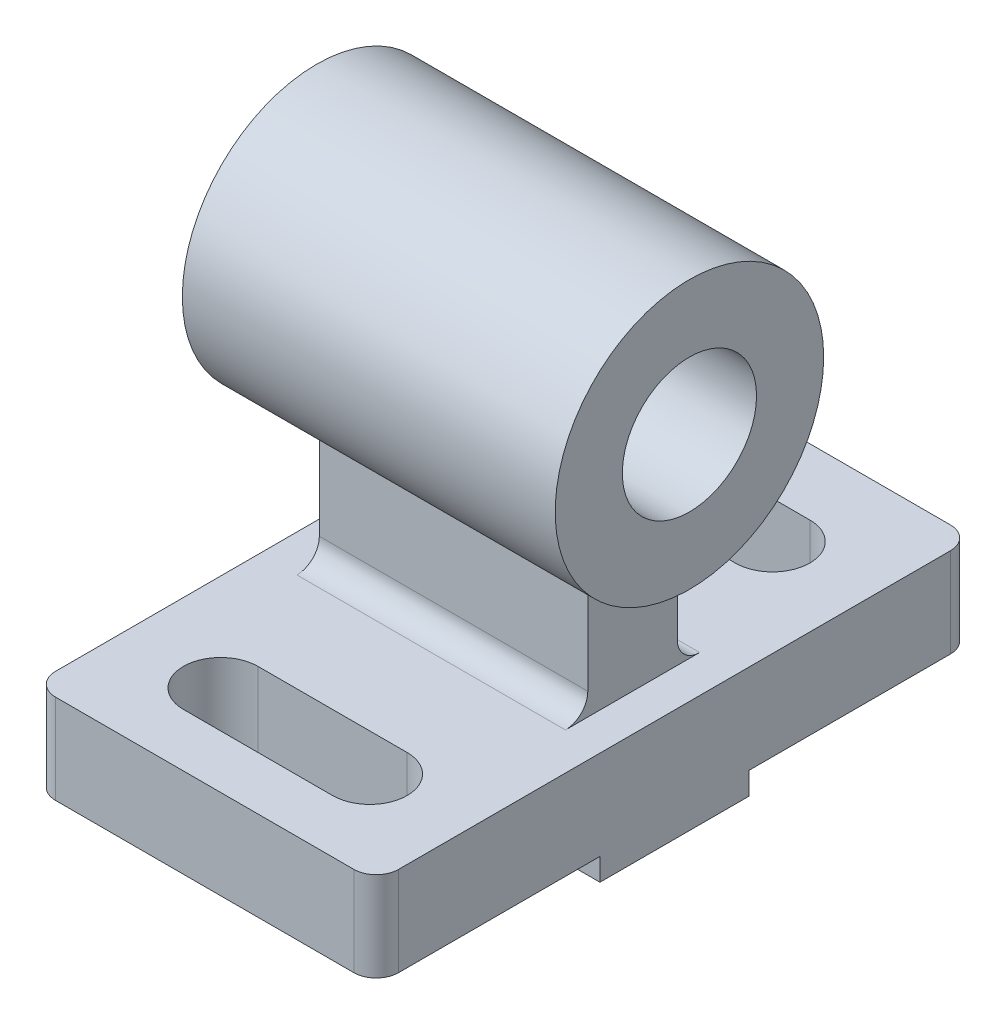
ISO-10303-21;
HEADER;
FILE_DESCRIPTION(('STEP AP214'),'2;1');
FILE_NAME('part.step','',(''),(''),'','','');
FILE_SCHEMA(('AUTOMOTIVE_DESIGN { 1 0 10303 214 1 1 1 1 }'));
ENDSEC;
DATA;
#1=APPLICATION_CONTEXT('core data for automotive mechanical design processes');
#2=APPLICATION_PROTOCOL_DEFINITION('international standard','automotive_design',2000,#1);
#3=PRODUCT_CONTEXT('',#1,'mechanical');
#4=PRODUCT('Part','Part','',(#3));
#5=PRODUCT_RELATED_PRODUCT_CATEGORY('part','',(#4));
#6=PRODUCT_DEFINITION_FORMATION('','',#4);
#7=PRODUCT_DEFINITION_CONTEXT('part definition',#1,'design');
#8=PRODUCT_DEFINITION('design','',#6,#7);
#9=PRODUCT_DEFINITION_SHAPE('','',#8);
#10=(LENGTH_UNIT() NAMED_UNIT(*) SI_UNIT(.MILLI.,.METRE.));
#11=(NAMED_UNIT(*) PLANE_ANGLE_UNIT() SI_UNIT($,.RADIAN.));
#12=(NAMED_UNIT(*) SI_UNIT($,.STERADIAN.) SOLID_ANGLE_UNIT());
#13=UNCERTAINTY_MEASURE_WITH_UNIT(LENGTH_MEASURE(1.E-05),#10,'distance_accuracy_value','');
#14=(GEOMETRIC_REPRESENTATION_CONTEXT(3) GLOBAL_UNCERTAINTY_ASSIGNED_CONTEXT((#13)) GLOBAL_UNIT_ASSIGNED_CONTEXT((#10,
#11,#12)) REPRESENTATION_CONTEXT('',''));
#15=CARTESIAN_POINT('',(0.,0.,0.));
#16=DIRECTION('',(0.,0.,1.));
#17=DIRECTION('',(1.,0.,0.));
#18=AXIS2_PLACEMENT_3D('',#15,#16,#17);
#19=CARTESIAN_POINT('',(-46.,12.,39.5180722891566));
#20=DIRECTION('',(0.,1.,0.));
#21=DIRECTION('',(0.,0.,1.));
#22=AXIS2_PLACEMENT_3D('',#19,#20,#21);
#23=PLANE('',#22);
#24=CARTESIAN_POINT('',(-33.,12.,27.3740929549103));
#25=DIRECTION('',(0.,1.,0.));
#26=DIRECTION('',(0.,0.,1.));
#27=AXIS2_PLACEMENT_3D('',#24,#25,#26);
#28=CIRCLE('',#27,5.);
#29=CARTESIAN_POINT('',(-33.,12.,22.3740929549103));
#30=VERTEX_POINT('',#29);
#31=CARTESIAN_POINT('',(-33.,12.,32.3740929549103));
#32=VERTEX_POINT('',#31);
#33=EDGE_CURVE('E244',#30,#32,#28,.T.);
#34=ORIENTED_EDGE('',*,*,#33,.F.);
#35=DIRECTION('',(-1.,0.,0.));
#36=VECTOR('',#35,1.);
#37=CARTESIAN_POINT('',(-33.,12.,22.3740929549103));
#38=LINE('',#37,#36);
#39=CARTESIAN_POINT('',(-13.,12.,22.3740929549102));
#40=VERTEX_POINT('',#39);
#41=EDGE_CURVE('E253',#40,#30,#38,.T.);
#42=ORIENTED_EDGE('',*,*,#41,.F.);
#43=CARTESIAN_POINT('',(-13.,12.,27.3740929549103));
#44=DIRECTION('',(0.,1.,0.));
#45=DIRECTION('',(0.,0.,1.));
#46=AXIS2_PLACEMENT_3D('',#43,#44,#45);
#47=CIRCLE('',#46,5.);
#48=CARTESIAN_POINT('',(-13.,12.,32.3740929549103));
#49=VERTEX_POINT('',#48);
#50=EDGE_CURVE('E250',#49,#40,#47,.T.);
#51=ORIENTED_EDGE('',*,*,#50,.F.);
#52=DIRECTION('',(1.,0.,0.));
#53=VECTOR('',#52,1.);
#54=CARTESIAN_POINT('',(-33.,12.,32.3740929549103));
#55=LINE('',#54,#53);
#56=EDGE_CURVE('E246',#32,#49,#55,.T.);
#57=ORIENTED_EDGE('',*,*,#56,.F.);
#58=EDGE_LOOP('',(#34,#42,#51,#57));
#59=FACE_BOUND('',#58,.T.);
#60=CARTESIAN_POINT('',(-33.,12.,-26.6259070450897));
#61=DIRECTION('',(0.,1.,0.));
#62=DIRECTION('',(0.,0.,1.));
#63=AXIS2_PLACEMENT_3D('',#60,#61,#62);
#64=CIRCLE('',#63,5.);
#65=CARTESIAN_POINT('',(-33.,12.,-31.6259070450897));
#66=VERTEX_POINT('',#65);
#67=CARTESIAN_POINT('',(-33.,12.,-21.6259070450897));
#68=VERTEX_POINT('',#67);
#69=EDGE_CURVE('E247',#66,#68,#64,.T.);
#70=ORIENTED_EDGE('',*,*,#69,.F.);
#71=DIRECTION('',(-1.,0.,0.));
#72=VECTOR('',#71,1.);
#73=CARTESIAN_POINT('',(-33.,12.,-31.6259070450897));
#74=LINE('',#73,#72);
#75=CARTESIAN_POINT('',(-13.,12.,-31.6259070450897));
#76=VERTEX_POINT('',#75);
#77=EDGE_CURVE('E269',#76,#66,#74,.T.);
#78=ORIENTED_EDGE('',*,*,#77,.F.);
#79=CARTESIAN_POINT('',(-13.,12.,-26.6259070450897));
#80=DIRECTION('',(0.,1.,0.));
#81=DIRECTION('',(0.,0.,1.));
#82=AXIS2_PLACEMENT_3D('',#79,#80,#81);
#83=CIRCLE('',#82,5.);
#84=CARTESIAN_POINT('',(-13.,12.,-21.6259070450897));
#85=VERTEX_POINT('',#84);
#86=EDGE_CURVE('E275',#85,#76,#83,.T.);
#87=ORIENTED_EDGE('',*,*,#86,.F.);
#88=DIRECTION('',(1.,0.,0.));
#89=VECTOR('',#88,1.);
#90=CARTESIAN_POINT('',(-33.,12.,-21.6259070450897));
#91=LINE('',#90,#89);
#92=EDGE_CURVE('E278',#68,#85,#91,.T.);
#93=ORIENTED_EDGE('',*,*,#92,.F.);
#94=EDGE_LOOP('',(#70,#78,#87,#93));
#95=FACE_BOUND('',#94,.T.);
#96=DIRECTION('',(0.,0.,1.));
#97=VECTOR('',#96,1.);
#98=CARTESIAN_POINT('',(0.,12.,39.5180722891566));
#99=LINE('',#98,#97);
#100=CARTESIAN_POINT('',(0.,12.,-37.4819277108434));
#101=VERTEX_POINT('',#100);
#102=CARTESIAN_POINT('',(0.,12.,36.5180722891566));
#103=VERTEX_POINT('',#102);
#104=EDGE_CURVE('E294',#101,#103,#99,.T.);
#105=ORIENTED_EDGE('',*,*,#104,.F.);
#106=CARTESIAN_POINT('',(-3.,12.,-37.4819277108434));
#107=DIRECTION('',(0.,1.,0.));
#108=DIRECTION('',(0.,0.,1.));
#109=AXIS2_PLACEMENT_3D('',#106,#107,#108);
#110=CIRCLE('',#109,3.);
#111=CARTESIAN_POINT('',(-3.,12.,-40.4819277108434));
#112=VERTEX_POINT('',#111);
#113=EDGE_CURVE('E357',#101,#112,#110,.T.);
#114=ORIENTED_EDGE('',*,*,#113,.T.);
#115=DIRECTION('',(1.,0.,0.));
#116=VECTOR('',#115,1.);
#117=CARTESIAN_POINT('',(-46.,12.,-40.4819277108434));
#118=LINE('',#117,#116);
#119=CARTESIAN_POINT('',(-43.,12.,-40.4819277108434));
#120=VERTEX_POINT('',#119);
#121=EDGE_CURVE('E332',#120,#112,#118,.T.);
#122=ORIENTED_EDGE('',*,*,#121,.F.);
#123=CARTESIAN_POINT('',(-43.,12.,-37.4819277108434));
#124=DIRECTION('',(0.,1.,0.));
#125=DIRECTION('',(0.,0.,1.));
#126=AXIS2_PLACEMENT_3D('',#123,#124,#125);
#127=CIRCLE('',#126,3.);
#128=CARTESIAN_POINT('',(-46.,12.,-37.4819277108434));
#129=VERTEX_POINT('',#128);
#130=EDGE_CURVE('E353',#120,#129,#127,.T.);
#131=ORIENTED_EDGE('',*,*,#130,.T.);
#132=DIRECTION('',(0.,0.,1.));
#133=VECTOR('',#132,1.);
#134=CARTESIAN_POINT('',(-46.,12.,39.5180722891566));
#135=LINE('',#134,#133);
#136=CARTESIAN_POINT('',(-46.,12.,36.5180722891566));
#137=VERTEX_POINT('',#136);
#138=EDGE_CURVE('E306',#129,#137,#135,.T.);
#139=ORIENTED_EDGE('',*,*,#138,.T.);
#140=CARTESIAN_POINT('',(-43.,12.,36.5180722891566));
#141=DIRECTION('',(0.,1.,0.));
#142=DIRECTION('',(0.,0.,1.));
#143=AXIS2_PLACEMENT_3D('',#140,#141,#142);
#144=CIRCLE('',#143,3.);
#145=CARTESIAN_POINT('',(-43.,12.,39.5180722891566));
#146=VERTEX_POINT('',#145);
#147=EDGE_CURVE('E355',#137,#146,#144,.T.);
#148=ORIENTED_EDGE('',*,*,#147,.T.);
#149=DIRECTION('',(1.,0.,0.));
#150=VECTOR('',#149,1.);
#151=CARTESIAN_POINT('',(-46.,12.,39.5180722891566));
#152=LINE('',#151,#150);
#153=CARTESIAN_POINT('',(-3.,12.,39.5180722891566));
#154=VERTEX_POINT('',#153);
#155=EDGE_CURVE('E329',#146,#154,#152,.T.);
#156=ORIENTED_EDGE('',*,*,#155,.T.);
#157=CARTESIAN_POINT('',(-3.,12.,36.5180722891566));
#158=DIRECTION('',(0.,1.,0.));
#159=DIRECTION('',(0.,0.,1.));
#160=AXIS2_PLACEMENT_3D('',#157,#158,#159);
#161=CIRCLE('',#160,3.);
#162=EDGE_CURVE('E351',#154,#103,#161,.T.);
#163=ORIENTED_EDGE('',*,*,#162,.T.);
#164=EDGE_LOOP('',(#105,#114,#122,#131,#139,#148,#156,#163));
#165=FACE_BOUND('',#164,.T.);
#166=DIRECTION('',(1.,0.,0.));
#167=VECTOR('',#166,1.);
#168=CARTESIAN_POINT('',(-5.,12.,-8.85139096311609));
#169=LINE('',#168,#167);
#170=CARTESIAN_POINT('',(-41.,12.,-8.85139096311609));
#171=VERTEX_POINT('',#170);
#172=CARTESIAN_POINT('',(-5.,12.,-8.85139096311609));
#173=VERTEX_POINT('',#172);
#174=EDGE_CURVE('E393',#171,#173,#169,.T.);
#175=ORIENTED_EDGE('',*,*,#174,.T.);
#176=DIRECTION('',(0.,0.,-1.));
#177=VECTOR('',#176,1.);
#178=CARTESIAN_POINT('',(-5.,12.,6.14860903688391));
#179=LINE('',#178,#177);
#180=CARTESIAN_POINT('',(-5.,12.,9.14860903688391));
#181=VERTEX_POINT('',#180);
#182=EDGE_CURVE('E221',#181,#173,#179,.T.);
#183=ORIENTED_EDGE('',*,*,#182,.F.);
#184=DIRECTION('',(1.,0.,0.));
#185=VECTOR('',#184,1.);
#186=CARTESIAN_POINT('',(-41.,12.,9.14860903688391));
#187=LINE('',#186,#185);
#188=CARTESIAN_POINT('',(-41.,12.,9.14860903688391));
#189=VERTEX_POINT('',#188);
#190=EDGE_CURVE('E390',#181,#189,#187,.F.);
#191=ORIENTED_EDGE('',*,*,#190,.T.);
#192=DIRECTION('',(0.,0.,-1.));
#193=VECTOR('',#192,1.);
#194=CARTESIAN_POINT('',(-41.,12.,6.14860903688391));
#195=LINE('',#194,#193);
#196=EDGE_CURVE('E404',#189,#171,#195,.T.);
#197=ORIENTED_EDGE('',*,*,#196,.T.);
#198=EDGE_LOOP('',(#175,#183,#191,#197));
#199=FACE_BOUND('',#198,.T.);
#200=ADVANCED_FACE('F37',(#59,#95,#165,#199),#23,.T.);
#201=CARTESIAN_POINT('',(-46.,0.,9.51807228915663));
#202=DIRECTION('',(0.,-1.,0.));
#203=DIRECTION('',(0.,0.,-1.));
#204=AXIS2_PLACEMENT_3D('',#201,#202,#203);
#205=PLANE('',#204);
#206=CARTESIAN_POINT('',(-33.,0.,27.3740929549103));
#207=DIRECTION('',(0.,-1.,0.));
#208=DIRECTION('',(0.,0.,-1.));
#209=AXIS2_PLACEMENT_3D('',#206,#207,#208);
#210=CIRCLE('',#209,5.);
#211=CARTESIAN_POINT('',(-33.,0.,32.3740929549103));
#212=VERTEX_POINT('',#211);
#213=CARTESIAN_POINT('',(-33.,0.,22.3740929549103));
#214=VERTEX_POINT('',#213);
#215=EDGE_CURVE('E288',#212,#214,#210,.T.);
#216=ORIENTED_EDGE('',*,*,#215,.F.);
#217=DIRECTION('',(-1.,0.,0.));
#218=VECTOR('',#217,1.);
#219=CARTESIAN_POINT('',(-46.,0.,32.3740929549103));
#220=LINE('',#219,#218);
#221=CARTESIAN_POINT('',(-13.,0.,32.3740929549103));
#222=VERTEX_POINT('',#221);
#223=EDGE_CURVE('E259',#222,#212,#220,.T.);
#224=ORIENTED_EDGE('',*,*,#223,.F.);
#225=CARTESIAN_POINT('',(-13.,0.,27.3740929549103));
#226=DIRECTION('',(0.,-1.,0.));
#227=DIRECTION('',(0.,0.,-1.));
#228=AXIS2_PLACEMENT_3D('',#225,#226,#227);
#229=CIRCLE('',#228,5.);
#230=CARTESIAN_POINT('',(-13.,0.,22.3740929549102));
#231=VERTEX_POINT('',#230);
#232=EDGE_CURVE('E283',#231,#222,#229,.T.);
#233=ORIENTED_EDGE('',*,*,#232,.F.);
#234=DIRECTION('',(1.,0.,0.));
#235=VECTOR('',#234,1.);
#236=CARTESIAN_POINT('',(-46.,0.,22.3740929549103));
#237=LINE('',#236,#235);
#238=EDGE_CURVE('E286',#214,#231,#237,.T.);
#239=ORIENTED_EDGE('',*,*,#238,.F.);
#240=EDGE_LOOP('',(#216,#224,#233,#239));
#241=FACE_BOUND('',#240,.T.);
#242=DIRECTION('',(1.,0.,0.));
#243=VECTOR('',#242,1.);
#244=CARTESIAN_POINT('',(-46.,0.,39.5180722891566));
#245=LINE('',#244,#243);
#246=CARTESIAN_POINT('',(-43.,0.,39.5180722891566));
#247=VERTEX_POINT('',#246);
#248=CARTESIAN_POINT('',(-3.,0.,39.5180722891566));
#249=VERTEX_POINT('',#248);
#250=EDGE_CURVE('E325',#247,#249,#245,.T.);
#251=ORIENTED_EDGE('',*,*,#250,.F.);
#252=CARTESIAN_POINT('',(-43.,0.,36.5180722891566));
#253=DIRECTION('',(0.,-1.,0.));
#254=DIRECTION('',(0.,0.,-1.));
#255=AXIS2_PLACEMENT_3D('',#252,#253,#254);
#256=CIRCLE('',#255,3.);
#257=CARTESIAN_POINT('',(-46.,0.,36.5180722891566));
#258=VERTEX_POINT('',#257);
#259=EDGE_CURVE('E375',#247,#258,#256,.T.);
#260=ORIENTED_EDGE('',*,*,#259,.T.);
#261=DIRECTION('',(0.,0.,-1.));
#262=VECTOR('',#261,1.);
#263=CARTESIAN_POINT('',(-46.,0.,9.51807228915663));
#264=LINE('',#263,#262);
#265=CARTESIAN_POINT('',(-46.,0.,9.51807228915663));
#266=VERTEX_POINT('',#265);
#267=EDGE_CURVE('E291',#258,#266,#264,.T.);
#268=ORIENTED_EDGE('',*,*,#267,.T.);
#269=DIRECTION('',(1.,0.,0.));
#270=VECTOR('',#269,1.);
#271=CARTESIAN_POINT('',(-46.,0.,9.51807228915663));
#272=LINE('',#271,#270);
#273=CARTESIAN_POINT('',(0.,0.,9.51807228915663));
#274=VERTEX_POINT('',#273);
#275=EDGE_CURVE('E309',#266,#274,#272,.T.);
#276=ORIENTED_EDGE('',*,*,#275,.T.);
#277=DIRECTION('',(0.,0.,-1.));
#278=VECTOR('',#277,1.);
#279=CARTESIAN_POINT('',(0.,0.,9.51807228915663));
#280=LINE('',#279,#278);
#281=CARTESIAN_POINT('',(0.,0.,36.5180722891566));
#282=VERTEX_POINT('',#281);
#283=EDGE_CURVE('E290',#282,#274,#280,.T.);
#284=ORIENTED_EDGE('',*,*,#283,.F.);
#285=CARTESIAN_POINT('',(-3.,0.,36.5180722891566));
#286=DIRECTION('',(0.,-1.,0.));
#287=DIRECTION('',(0.,0.,-1.));
#288=AXIS2_PLACEMENT_3D('',#285,#286,#287);
#289=CIRCLE('',#288,3.);
#290=EDGE_CURVE('E373',#282,#249,#289,.T.);
#291=ORIENTED_EDGE('',*,*,#290,.T.);
#292=EDGE_LOOP('',(#251,#260,#268,#276,#284,#291));
#293=FACE_BOUND('',#292,.T.);
#294=ADVANCED_FACE('F450',(#241,#293),#205,.T.);
#295=CARTESIAN_POINT('',(-46.,0.,39.5180722891566));
#296=DIRECTION('',(0.,0.,1.));
#297=DIRECTION('',(1.,0.,0.));
#298=AXIS2_PLACEMENT_3D('',#295,#296,#297);
#299=PLANE('',#298);
#300=ORIENTED_EDGE('',*,*,#155,.F.);
#301=DIRECTION('',(0.,-1.,0.));
#302=VECTOR('',#301,1.);
#303=CARTESIAN_POINT('',(-43.,0.,39.5180722891566));
#304=LINE('',#303,#302);
#305=EDGE_CURVE('E370',#146,#247,#304,.T.);
#306=ORIENTED_EDGE('',*,*,#305,.T.);
#307=ORIENTED_EDGE('',*,*,#250,.T.);
#308=DIRECTION('',(0.,-1.,0.));
#309=VECTOR('',#308,1.);
#310=CARTESIAN_POINT('',(-3.,12.,39.5180722891566));
#311=LINE('',#310,#309);
#312=EDGE_CURVE('E368',#249,#154,#311,.F.);
#313=ORIENTED_EDGE('',*,*,#312,.T.);
#314=EDGE_LOOP('',(#300,#306,#307,#313));
#315=FACE_BOUND('',#314,.T.);
#316=ADVANCED_FACE('F456',(#315),#299,.T.);
#317=CARTESIAN_POINT('',(-46.,12.,-40.4819277108434));
#318=DIRECTION('',(0.,0.,-1.));
#319=DIRECTION('',(-1.,0.,0.));
#320=AXIS2_PLACEMENT_3D('',#317,#318,#319);
#321=PLANE('',#320);
#322=ORIENTED_EDGE('',*,*,#121,.T.);
#323=DIRECTION('',(0.,1.,0.));
#324=VECTOR('',#323,1.);
#325=CARTESIAN_POINT('',(-3.,0.,-40.4819277108434));
#326=LINE('',#325,#324);
#327=CARTESIAN_POINT('',(-3.,0.,-40.4819277108434));
#328=VERTEX_POINT('',#327);
#329=EDGE_CURVE('E362',#112,#328,#326,.F.);
#330=ORIENTED_EDGE('',*,*,#329,.T.);
#331=DIRECTION('',(1.,0.,0.));
#332=VECTOR('',#331,1.);
#333=CARTESIAN_POINT('',(-46.,0.,-40.4819277108434));
#334=LINE('',#333,#332);
#335=CARTESIAN_POINT('',(-43.,0.,-40.4819277108434));
#336=VERTEX_POINT('',#335);
#337=EDGE_CURVE('E335',#336,#328,#334,.T.);
#338=ORIENTED_EDGE('',*,*,#337,.F.);
#339=DIRECTION('',(0.,1.,0.));
#340=VECTOR('',#339,1.);
#341=CARTESIAN_POINT('',(-43.,12.,-40.4819277108434));
#342=LINE('',#341,#340);
#343=EDGE_CURVE('E359',#336,#120,#342,.T.);
#344=ORIENTED_EDGE('',*,*,#343,.T.);
#345=EDGE_LOOP('',(#322,#330,#338,#344));
#346=FACE_BOUND('',#345,.T.);
#347=ADVANCED_FACE('F464',(#346),#321,.T.);
#348=CARTESIAN_POINT('',(-46.,0.,-40.4819277108434));
#349=DIRECTION('',(0.,-1.,0.));
#350=DIRECTION('',(0.,0.,-1.));
#351=AXIS2_PLACEMENT_3D('',#348,#349,#350);
#352=PLANE('',#351);
#353=CARTESIAN_POINT('',(-33.,0.,-26.6259070450897));
#354=DIRECTION('',(0.,-1.,0.));
#355=DIRECTION('',(0.,0.,-1.));
#356=AXIS2_PLACEMENT_3D('',#353,#354,#355);
#357=CIRCLE('',#356,5.);
#358=CARTESIAN_POINT('',(-33.,0.,-21.6259070450897));
#359=VERTEX_POINT('',#358);
#360=CARTESIAN_POINT('',(-33.,0.,-31.6259070450897));
#361=VERTEX_POINT('',#360);
#362=EDGE_CURVE('E388',#359,#361,#357,.T.);
#363=ORIENTED_EDGE('',*,*,#362,.F.);
#364=DIRECTION('',(-1.,0.,0.));
#365=VECTOR('',#364,1.);
#366=CARTESIAN_POINT('',(-46.,0.,-21.6259070450897));
#367=LINE('',#366,#365);
#368=CARTESIAN_POINT('',(-13.,0.,-21.6259070450897));
#369=VERTEX_POINT('',#368);
#370=EDGE_CURVE('E381',#369,#359,#367,.T.);
#371=ORIENTED_EDGE('',*,*,#370,.F.);
#372=CARTESIAN_POINT('',(-13.,0.,-26.6259070450897));
#373=DIRECTION('',(0.,-1.,0.));
#374=DIRECTION('',(0.,0.,-1.));
#375=AXIS2_PLACEMENT_3D('',#372,#373,#374);
#376=CIRCLE('',#375,5.);
#377=CARTESIAN_POINT('',(-13.,0.,-31.6259070450897));
#378=VERTEX_POINT('',#377);
#379=EDGE_CURVE('E383',#378,#369,#376,.T.);
#380=ORIENTED_EDGE('',*,*,#379,.F.);
#381=DIRECTION('',(1.,0.,0.));
#382=VECTOR('',#381,1.);
#383=CARTESIAN_POINT('',(-46.,0.,-31.6259070450897));
#384=LINE('',#383,#382);
#385=EDGE_CURVE('E386',#361,#378,#384,.T.);
#386=ORIENTED_EDGE('',*,*,#385,.F.);
#387=EDGE_LOOP('',(#363,#371,#380,#386));
#388=FACE_BOUND('',#387,.T.);
#389=ORIENTED_EDGE('',*,*,#337,.T.);
#390=CARTESIAN_POINT('',(-3.,0.,-37.4819277108434));
#391=DIRECTION('',(0.,-1.,0.));
#392=DIRECTION('',(0.,0.,-1.));
#393=AXIS2_PLACEMENT_3D('',#390,#391,#392);
#394=CIRCLE('',#393,3.);
#395=CARTESIAN_POINT('',(0.,0.,-37.4819277108434));
#396=VERTEX_POINT('',#395);
#397=EDGE_CURVE('E366',#328,#396,#394,.T.);
#398=ORIENTED_EDGE('',*,*,#397,.T.);
#399=DIRECTION('',(0.,0.,-1.));
#400=VECTOR('',#399,1.);
#401=CARTESIAN_POINT('',(0.,0.,-40.4819277108434));
#402=LINE('',#401,#400);
#403=CARTESIAN_POINT('',(0.,0.,-10.4819277108434));
#404=VERTEX_POINT('',#403);
#405=EDGE_CURVE('E320',#404,#396,#402,.T.);
#406=ORIENTED_EDGE('',*,*,#405,.F.);
#407=DIRECTION('',(1.,0.,0.));
#408=VECTOR('',#407,1.);
#409=CARTESIAN_POINT('',(-46.,0.,-10.4819277108434));
#410=LINE('',#409,#408);
#411=CARTESIAN_POINT('',(-46.,0.,-10.4819277108434));
#412=VERTEX_POINT('',#411);
#413=EDGE_CURVE('E338',#412,#404,#410,.T.);
#414=ORIENTED_EDGE('',*,*,#413,.F.);
#415=DIRECTION('',(0.,0.,-1.));
#416=VECTOR('',#415,1.);
#417=CARTESIAN_POINT('',(-46.,0.,-40.4819277108434));
#418=LINE('',#417,#416);
#419=CARTESIAN_POINT('',(-46.,0.,-37.4819277108434));
#420=VERTEX_POINT('',#419);
#421=EDGE_CURVE('E303',#412,#420,#418,.T.);
#422=ORIENTED_EDGE('',*,*,#421,.T.);
#423=CARTESIAN_POINT('',(-43.,0.,-37.4819277108434));
#424=DIRECTION('',(0.,-1.,0.));
#425=DIRECTION('',(0.,0.,-1.));
#426=AXIS2_PLACEMENT_3D('',#423,#424,#425);
#427=CIRCLE('',#426,3.);
#428=EDGE_CURVE('E364',#420,#336,#427,.T.);
#429=ORIENTED_EDGE('',*,*,#428,.T.);
#430=EDGE_LOOP('',(#389,#398,#406,#414,#422,#429));
#431=FACE_BOUND('',#430,.T.);
#432=ADVANCED_FACE('F467',(#388,#431),#352,.T.);
#433=CARTESIAN_POINT('',(-46.,0.,-10.4819277108434));
#434=DIRECTION('',(0.,0.,-1.));
#435=DIRECTION('',(0.,1.,0.));
#436=AXIS2_PLACEMENT_3D('',#433,#434,#435);
#437=PLANE('',#436);
#438=DIRECTION('',(0.,1.,0.));
#439=VECTOR('',#438,1.);
#440=CARTESIAN_POINT('',(0.,0.,-10.4819277108434));
#441=LINE('',#440,#439);
#442=CARTESIAN_POINT('',(0.,-3.,-10.4819277108434));
#443=VERTEX_POINT('',#442);
#444=EDGE_CURVE('E317',#443,#404,#441,.T.);
#445=ORIENTED_EDGE('',*,*,#444,.F.);
#446=DIRECTION('',(1.,0.,0.));
#447=VECTOR('',#446,1.);
#448=CARTESIAN_POINT('',(-46.,-3.,-10.4819277108434));
#449=LINE('',#448,#447);
#450=CARTESIAN_POINT('',(-46.,-3.,-10.4819277108434));
#451=VERTEX_POINT('',#450);
#452=EDGE_CURVE('E340',#451,#443,#449,.T.);
#453=ORIENTED_EDGE('',*,*,#452,.F.);
#454=DIRECTION('',(0.,1.,0.));
#455=VECTOR('',#454,1.);
#456=CARTESIAN_POINT('',(-46.,0.,-10.4819277108434));
#457=LINE('',#456,#455);
#458=EDGE_CURVE('E300',#451,#412,#457,.T.);
#459=ORIENTED_EDGE('',*,*,#458,.T.);
#460=ORIENTED_EDGE('',*,*,#413,.T.);
#461=EDGE_LOOP('',(#445,#453,#459,#460));
#462=FACE_BOUND('',#461,.T.);
#463=ADVANCED_FACE('F471',(#462),#437,.T.);
#464=CARTESIAN_POINT('',(-46.,-3.,-10.4819277108434));
#465=DIRECTION('',(0.,-1.,0.));
#466=DIRECTION('',(0.,0.,-1.));
#467=AXIS2_PLACEMENT_3D('',#464,#465,#466);
#468=PLANE('',#467);
#469=DIRECTION('',(0.,0.,-1.));
#470=VECTOR('',#469,1.);
#471=CARTESIAN_POINT('',(0.,-3.,-10.4819277108434));
#472=LINE('',#471,#470);
#473=CARTESIAN_POINT('',(0.,-3.,9.51807228915663));
#474=VERTEX_POINT('',#473);
#475=EDGE_CURVE('E314',#474,#443,#472,.T.);
#476=ORIENTED_EDGE('',*,*,#475,.F.);
#477=DIRECTION('',(1.,0.,0.));
#478=VECTOR('',#477,1.);
#479=CARTESIAN_POINT('',(-46.,-3.,9.51807228915663));
#480=LINE('',#479,#478);
#481=CARTESIAN_POINT('',(-46.,-3.,9.51807228915663));
#482=VERTEX_POINT('',#481);
#483=EDGE_CURVE('E342',#482,#474,#480,.T.);
#484=ORIENTED_EDGE('',*,*,#483,.F.);
#485=DIRECTION('',(0.,0.,-1.));
#486=VECTOR('',#485,1.);
#487=CARTESIAN_POINT('',(-46.,-3.,-10.4819277108434));
#488=LINE('',#487,#486);
#489=EDGE_CURVE('E297',#482,#451,#488,.T.);
#490=ORIENTED_EDGE('',*,*,#489,.T.);
#491=ORIENTED_EDGE('',*,*,#452,.T.);
#492=EDGE_LOOP('',(#476,#484,#490,#491));
#493=FACE_BOUND('',#492,.T.);
#494=ADVANCED_FACE('F475',(#493),#468,.T.);
#495=CARTESIAN_POINT('',(-46.,-3.,9.51807228915663));
#496=DIRECTION('',(0.,0.,1.));
#497=DIRECTION('',(1.,0.,0.));
#498=AXIS2_PLACEMENT_3D('',#495,#496,#497);
#499=PLANE('',#498);
#500=DIRECTION('',(0.,-1.,0.));
#501=VECTOR('',#500,1.);
#502=CARTESIAN_POINT('',(0.,-3.,9.51807228915663));
#503=LINE('',#502,#501);
#504=EDGE_CURVE('E311',#274,#474,#503,.T.);
#505=ORIENTED_EDGE('',*,*,#504,.F.);
#506=ORIENTED_EDGE('',*,*,#275,.F.);
#507=DIRECTION('',(0.,-1.,0.));
#508=VECTOR('',#507,1.);
#509=CARTESIAN_POINT('',(-46.,-3.,9.51807228915663));
#510=LINE('',#509,#508);
#511=EDGE_CURVE('E293',#266,#482,#510,.T.);
#512=ORIENTED_EDGE('',*,*,#511,.T.);
#513=ORIENTED_EDGE('',*,*,#483,.T.);
#514=EDGE_LOOP('',(#505,#506,#512,#513));
#515=FACE_BOUND('',#514,.T.);
#516=ADVANCED_FACE('F479',(#515),#499,.T.);
#517=CARTESIAN_POINT('',(-46.,0.,0.));
#518=DIRECTION('',(-1.,0.,0.));
#519=DIRECTION('',(0.,0.,1.));
#520=AXIS2_PLACEMENT_3D('',#517,#518,#519);
#521=PLANE('',#520);
#522=ORIENTED_EDGE('',*,*,#267,.F.);
#523=DIRECTION('',(0.,-1.,0.));
#524=VECTOR('',#523,1.);
#525=CARTESIAN_POINT('',(-46.,0.,36.5180722891566));
#526=LINE('',#525,#524);
#527=EDGE_CURVE('E379',#258,#137,#526,.F.);
#528=ORIENTED_EDGE('',*,*,#527,.T.);
#529=ORIENTED_EDGE('',*,*,#138,.F.);
#530=DIRECTION('',(0.,1.,0.));
#531=VECTOR('',#530,1.);
#532=CARTESIAN_POINT('',(-46.,0.,-37.4819277108434));
#533=LINE('',#532,#531);
#534=EDGE_CURVE('E377',#129,#420,#533,.F.);
#535=ORIENTED_EDGE('',*,*,#534,.T.);
#536=ORIENTED_EDGE('',*,*,#421,.F.);
#537=ORIENTED_EDGE('',*,*,#458,.F.);
#538=ORIENTED_EDGE('',*,*,#489,.F.);
#539=ORIENTED_EDGE('',*,*,#511,.F.);
#540=EDGE_LOOP('',(#522,#528,#529,#535,#536,#537,#538,#539));
#541=FACE_BOUND('',#540,.T.);
#542=ADVANCED_FACE('F482',(#541),#521,.T.);
#543=CARTESIAN_POINT('',(0.,0.,0.));
#544=DIRECTION('',(-1.,0.,0.));
#545=DIRECTION('',(0.,0.,1.));
#546=AXIS2_PLACEMENT_3D('',#543,#544,#545);
#547=PLANE('',#546);
#548=ORIENTED_EDGE('',*,*,#405,.T.);
#549=DIRECTION('',(0.,1.,0.));
#550=VECTOR('',#549,1.);
#551=CARTESIAN_POINT('',(0.,12.,-37.4819277108434));
#552=LINE('',#551,#550);
#553=EDGE_CURVE('E348',#396,#101,#552,.T.);
#554=ORIENTED_EDGE('',*,*,#553,.T.);
#555=ORIENTED_EDGE('',*,*,#104,.T.);
#556=DIRECTION('',(0.,-1.,0.));
#557=VECTOR('',#556,1.);
#558=CARTESIAN_POINT('',(0.,0.,36.5180722891566));
#559=LINE('',#558,#557);
#560=EDGE_CURVE('E328',#103,#282,#559,.T.);
#561=ORIENTED_EDGE('',*,*,#560,.T.);
#562=ORIENTED_EDGE('',*,*,#283,.T.);
#563=ORIENTED_EDGE('',*,*,#504,.T.);
#564=ORIENTED_EDGE('',*,*,#475,.T.);
#565=ORIENTED_EDGE('',*,*,#444,.T.);
#566=EDGE_LOOP('',(#548,#554,#555,#561,#562,#563,#564,#565));
#567=FACE_BOUND('',#566,.T.);
#568=ADVANCED_FACE('F489',(#567),#547,.F.);
#569=CARTESIAN_POINT('',(-3.,0.,-37.4819277108434));
#570=DIRECTION('',(0.,-1.,0.));
#571=DIRECTION('',(0.,0.,-1.));
#572=AXIS2_PLACEMENT_3D('',#569,#570,#571);
#573=CYLINDRICAL_SURFACE('',#572,3.);
#574=ORIENTED_EDGE('',*,*,#397,.F.);
#575=ORIENTED_EDGE('',*,*,#329,.F.);
#576=ORIENTED_EDGE('',*,*,#113,.F.);
#577=ORIENTED_EDGE('',*,*,#553,.F.);
#578=EDGE_LOOP('',(#574,#575,#576,#577));
#579=FACE_BOUND('',#578,.T.);
#580=ADVANCED_FACE('F485',(#579),#573,.T.);
#581=CARTESIAN_POINT('',(-43.,0.,36.5180722891566));
#582=DIRECTION('',(0.,-1.,0.));
#583=DIRECTION('',(0.,0.,-1.));
#584=AXIS2_PLACEMENT_3D('',#581,#582,#583);
#585=CYLINDRICAL_SURFACE('',#584,3.);
#586=ORIENTED_EDGE('',*,*,#147,.F.);
#587=ORIENTED_EDGE('',*,*,#527,.F.);
#588=ORIENTED_EDGE('',*,*,#259,.F.);
#589=ORIENTED_EDGE('',*,*,#305,.F.);
#590=EDGE_LOOP('',(#586,#587,#588,#589));
#591=FACE_BOUND('',#590,.T.);
#592=ADVANCED_FACE('F488',(#591),#585,.T.);
#593=CARTESIAN_POINT('',(-43.,12.,-37.4819277108434));
#594=DIRECTION('',(0.,1.,0.));
#595=DIRECTION('',(0.,0.,1.));
#596=AXIS2_PLACEMENT_3D('',#593,#594,#595);
#597=CYLINDRICAL_SURFACE('',#596,3.);
#598=ORIENTED_EDGE('',*,*,#428,.F.);
#599=ORIENTED_EDGE('',*,*,#534,.F.);
#600=ORIENTED_EDGE('',*,*,#130,.F.);
#601=ORIENTED_EDGE('',*,*,#343,.F.);
#602=EDGE_LOOP('',(#598,#599,#600,#601));
#603=FACE_BOUND('',#602,.T.);
#604=ADVANCED_FACE('F493',(#603),#597,.T.);
#605=CARTESIAN_POINT('',(-3.,0.,36.5180722891566));
#606=DIRECTION('',(0.,1.,0.));
#607=DIRECTION('',(0.,0.,1.));
#608=AXIS2_PLACEMENT_3D('',#605,#606,#607);
#609=CYLINDRICAL_SURFACE('',#608,3.);
#610=ORIENTED_EDGE('',*,*,#162,.F.);
#611=ORIENTED_EDGE('',*,*,#312,.F.);
#612=ORIENTED_EDGE('',*,*,#290,.F.);
#613=ORIENTED_EDGE('',*,*,#560,.F.);
#614=EDGE_LOOP('',(#610,#611,#612,#613));
#615=FACE_BOUND('',#614,.T.);
#616=ADVANCED_FACE('F497',(#615),#609,.T.);
#617=CARTESIAN_POINT('',(-33.,-34.,-26.6259070450897));
#618=DIRECTION('',(0.,1.,0.));
#619=DIRECTION('',(0.,0.,1.));
#620=AXIS2_PLACEMENT_3D('',#617,#618,#619);
#621=CYLINDRICAL_SURFACE('',#620,5.);
#622=ORIENTED_EDGE('',*,*,#362,.T.);
#623=DIRECTION('',(0.,1.,0.));
#624=VECTOR('',#623,1.);
#625=CARTESIAN_POINT('',(-33.,-34.,-31.6259070450897));
#626=LINE('',#625,#624);
#627=EDGE_CURVE('E237',#361,#66,#626,.T.);
#628=ORIENTED_EDGE('',*,*,#627,.T.);
#629=ORIENTED_EDGE('',*,*,#69,.T.);
#630=DIRECTION('',(0.,1.,0.));
#631=VECTOR('',#630,1.);
#632=CARTESIAN_POINT('',(-33.,-34.,-21.6259070450897));
#633=LINE('',#632,#631);
#634=EDGE_CURVE('E266',#359,#68,#633,.T.);
#635=ORIENTED_EDGE('',*,*,#634,.F.);
#636=EDGE_LOOP('',(#622,#628,#629,#635));
#637=FACE_BOUND('',#636,.T.);
#638=ADVANCED_FACE('F500',(#637),#621,.F.);
#639=CARTESIAN_POINT('',(-33.,-34.,-31.6259070450897));
#640=DIRECTION('',(0.,0.,-1.));
#641=DIRECTION('',(-1.,0.,0.));
#642=AXIS2_PLACEMENT_3D('',#639,#640,#641);
#643=PLANE('',#642);
#644=ORIENTED_EDGE('',*,*,#385,.T.);
#645=DIRECTION('',(0.,1.,0.));
#646=VECTOR('',#645,1.);
#647=CARTESIAN_POINT('',(-13.,-34.,-31.6259070450897));
#648=LINE('',#647,#646);
#649=EDGE_CURVE('E239',#378,#76,#648,.T.);
#650=ORIENTED_EDGE('',*,*,#649,.T.);
#651=ORIENTED_EDGE('',*,*,#77,.T.);
#652=ORIENTED_EDGE('',*,*,#627,.F.);
#653=EDGE_LOOP('',(#644,#650,#651,#652));
#654=FACE_BOUND('',#653,.T.);
#655=ADVANCED_FACE('F540',(#654),#643,.F.);
#656=CARTESIAN_POINT('',(-13.,-34.,-26.6259070450897));
#657=DIRECTION('',(0.,1.,0.));
#658=DIRECTION('',(0.,0.,1.));
#659=AXIS2_PLACEMENT_3D('',#656,#657,#658);
#660=CYLINDRICAL_SURFACE('',#659,5.);
#661=ORIENTED_EDGE('',*,*,#379,.T.);
#662=DIRECTION('',(0.,1.,0.));
#663=VECTOR('',#662,1.);
#664=CARTESIAN_POINT('',(-13.,-34.,-21.6259070450897));
#665=LINE('',#664,#663);
#666=EDGE_CURVE('E270',#369,#85,#665,.T.);
#667=ORIENTED_EDGE('',*,*,#666,.T.);
#668=ORIENTED_EDGE('',*,*,#86,.T.);
#669=ORIENTED_EDGE('',*,*,#649,.F.);
#670=EDGE_LOOP('',(#661,#667,#668,#669));
#671=FACE_BOUND('',#670,.T.);
#672=ADVANCED_FACE('F544',(#671),#660,.F.);
#673=CARTESIAN_POINT('',(-33.,-34.,-21.6259070450897));
#674=DIRECTION('',(0.,0.,1.));
#675=DIRECTION('',(1.,0.,0.));
#676=AXIS2_PLACEMENT_3D('',#673,#674,#675);
#677=PLANE('',#676);
#678=ORIENTED_EDGE('',*,*,#370,.T.);
#679=ORIENTED_EDGE('',*,*,#634,.T.);
#680=ORIENTED_EDGE('',*,*,#92,.T.);
#681=ORIENTED_EDGE('',*,*,#666,.F.);
#682=EDGE_LOOP('',(#678,#679,#680,#681));
#683=FACE_BOUND('',#682,.T.);
#684=ADVANCED_FACE('F536',(#683),#677,.F.);
#685=CARTESIAN_POINT('',(-33.,-34.,27.3740929549103));
#686=DIRECTION('',(0.,1.,0.));
#687=DIRECTION('',(0.,0.,1.));
#688=AXIS2_PLACEMENT_3D('',#685,#686,#687);
#689=CYLINDRICAL_SURFACE('',#688,5.);
#690=ORIENTED_EDGE('',*,*,#215,.T.);
#691=DIRECTION('',(0.,1.,0.));
#692=VECTOR('',#691,1.);
#693=CARTESIAN_POINT('',(-33.,-34.,22.3740929549103));
#694=LINE('',#693,#692);
#695=EDGE_CURVE('E257',#214,#30,#694,.T.);
#696=ORIENTED_EDGE('',*,*,#695,.T.);
#697=ORIENTED_EDGE('',*,*,#33,.T.);
#698=DIRECTION('',(0.,1.,0.));
#699=VECTOR('',#698,1.);
#700=CARTESIAN_POINT('',(-33.,-34.,32.3740929549103));
#701=LINE('',#700,#699);
#702=EDGE_CURVE('E256',#212,#32,#701,.T.);
#703=ORIENTED_EDGE('',*,*,#702,.F.);
#704=EDGE_LOOP('',(#690,#696,#697,#703));
#705=FACE_BOUND('',#704,.T.);
#706=ADVANCED_FACE('F526',(#705),#689,.F.);
#707=CARTESIAN_POINT('',(-33.,-34.,22.3740929549103));
#708=DIRECTION('',(0.,0.,-1.));
#709=DIRECTION('',(-1.,0.,0.));
#710=AXIS2_PLACEMENT_3D('',#707,#708,#709);
#711=PLANE('',#710);
#712=ORIENTED_EDGE('',*,*,#238,.T.);
#713=DIRECTION('',(0.,1.,0.));
#714=VECTOR('',#713,1.);
#715=CARTESIAN_POINT('',(-13.,-34.,22.3740929549102));
#716=LINE('',#715,#714);
#717=EDGE_CURVE('E260',#231,#40,#716,.T.);
#718=ORIENTED_EDGE('',*,*,#717,.T.);
#719=ORIENTED_EDGE('',*,*,#41,.T.);
#720=ORIENTED_EDGE('',*,*,#695,.F.);
#721=EDGE_LOOP('',(#712,#718,#719,#720));
#722=FACE_BOUND('',#721,.T.);
#723=ADVANCED_FACE('F522',(#722),#711,.F.);
#724=CARTESIAN_POINT('',(-13.,-34.,27.3740929549103));
#725=DIRECTION('',(0.,1.,0.));
#726=DIRECTION('',(0.,0.,1.));
#727=AXIS2_PLACEMENT_3D('',#724,#725,#726);
#728=CYLINDRICAL_SURFACE('',#727,5.);
#729=ORIENTED_EDGE('',*,*,#232,.T.);
#730=DIRECTION('',(0.,1.,0.));
#731=VECTOR('',#730,1.);
#732=CARTESIAN_POINT('',(-13.,-34.,32.3740929549103));
#733=LINE('',#732,#731);
#734=EDGE_CURVE('E262',#222,#49,#733,.T.);
#735=ORIENTED_EDGE('',*,*,#734,.T.);
#736=ORIENTED_EDGE('',*,*,#50,.T.);
#737=ORIENTED_EDGE('',*,*,#717,.F.);
#738=EDGE_LOOP('',(#729,#735,#736,#737));
#739=FACE_BOUND('',#738,.T.);
#740=ADVANCED_FACE('F525',(#739),#728,.F.);
#741=CARTESIAN_POINT('',(-33.,-34.,32.3740929549103));
#742=DIRECTION('',(0.,0.,1.));
#743=DIRECTION('',(1.,0.,0.));
#744=AXIS2_PLACEMENT_3D('',#741,#742,#743);
#745=PLANE('',#744);
#746=ORIENTED_EDGE('',*,*,#223,.T.);
#747=ORIENTED_EDGE('',*,*,#702,.T.);
#748=ORIENTED_EDGE('',*,*,#56,.T.);
#749=ORIENTED_EDGE('',*,*,#734,.F.);
#750=EDGE_LOOP('',(#746,#747,#748,#749));
#751=FACE_BOUND('',#750,.T.);
#752=ADVANCED_FACE('F518',(#751),#745,.F.);
#753=CARTESIAN_POINT('',(-41.,12.,-5.85139096311609));
#754=DIRECTION('',(0.,0.,-1.));
#755=DIRECTION('',(0.,1.,0.));
#756=AXIS2_PLACEMENT_3D('',#753,#754,#755);
#757=PLANE('',#756);
#758=DIRECTION('',(0.,1.,0.));
#759=VECTOR('',#758,1.);
#760=CARTESIAN_POINT('',(-5.,12.,-5.85139096311609));
#761=LINE('',#760,#759);
#762=CARTESIAN_POINT('',(-5.,15.,-5.85139096311609));
#763=VERTEX_POINT('',#762);
#764=CARTESIAN_POINT('',(-5.,27.8195208337342,-5.85139096311608));
#765=VERTEX_POINT('',#764);
#766=EDGE_CURVE('E210',#763,#765,#761,.T.);
#767=ORIENTED_EDGE('',*,*,#766,.F.);
#768=DIRECTION('',(1.,0.,0.));
#769=VECTOR('',#768,1.);
#770=CARTESIAN_POINT('',(-41.,15.,-5.85139096311609));
#771=LINE('',#770,#769);
#772=CARTESIAN_POINT('',(-41.,15.,-5.85139096311609));
#773=VERTEX_POINT('',#772);
#774=EDGE_CURVE('E396',#763,#773,#771,.F.);
#775=ORIENTED_EDGE('',*,*,#774,.T.);
#776=DIRECTION('',(0.,1.,0.));
#777=VECTOR('',#776,1.);
#778=CARTESIAN_POINT('',(-41.,12.,-5.85139096311609));
#779=LINE('',#778,#777);
#780=CARTESIAN_POINT('',(-41.,27.8195208337342,-5.85139096311608));
#781=VERTEX_POINT('',#780);
#782=EDGE_CURVE('E236',#773,#781,#779,.T.);
#783=ORIENTED_EDGE('',*,*,#782,.T.);
#784=DIRECTION('',(1.,0.,0.));
#785=VECTOR('',#784,1.);
#786=CARTESIAN_POINT('',(-41.,27.8195208337342,-5.85139096311608));
#787=LINE('',#786,#785);
#788=EDGE_CURVE('E226',#781,#765,#787,.T.);
#789=ORIENTED_EDGE('',*,*,#788,.T.);
#790=EDGE_LOOP('',(#767,#775,#783,#789));
#791=FACE_BOUND('',#790,.T.);
#792=ADVANCED_FACE('F234',(#791),#757,.T.);
#793=CARTESIAN_POINT('',(-41.,28.2657243229043,6.14860903688391));
#794=DIRECTION('',(0.,0.,1.));
#795=DIRECTION('',(0.,-1.,0.));
#796=AXIS2_PLACEMENT_3D('',#793,#794,#795);
#797=PLANE('',#796);
#798=DIRECTION('',(0.,-1.,0.));
#799=VECTOR('',#798,1.);
#800=CARTESIAN_POINT('',(-41.,28.2657243229043,6.14860903688391));
#801=LINE('',#800,#799);
#802=CARTESIAN_POINT('',(-41.,28.2657243229043,6.14860903688391));
#803=VERTEX_POINT('',#802);
#804=CARTESIAN_POINT('',(-41.,15.,6.14860903688391));
#805=VERTEX_POINT('',#804);
#806=EDGE_CURVE('E410',#803,#805,#801,.T.);
#807=ORIENTED_EDGE('',*,*,#806,.T.);
#808=DIRECTION('',(1.,0.,0.));
#809=VECTOR('',#808,1.);
#810=CARTESIAN_POINT('',(-5.,15.,6.14860903688391));
#811=LINE('',#810,#809);
#812=CARTESIAN_POINT('',(-5.,15.,6.14860903688391));
#813=VERTEX_POINT('',#812);
#814=EDGE_CURVE('E398',#805,#813,#811,.T.);
#815=ORIENTED_EDGE('',*,*,#814,.T.);
#816=DIRECTION('',(0.,-1.,0.));
#817=VECTOR('',#816,1.);
#818=CARTESIAN_POINT('',(-5.,28.2657243229043,6.14860903688391));
#819=LINE('',#818,#817);
#820=CARTESIAN_POINT('',(-5.,28.2657243229043,6.14860903688391));
#821=VERTEX_POINT('',#820);
#822=EDGE_CURVE('E231',#821,#813,#819,.T.);
#823=ORIENTED_EDGE('',*,*,#822,.F.);
#824=DIRECTION('',(1.,0.,0.));
#825=VECTOR('',#824,1.);
#826=CARTESIAN_POINT('',(-41.,28.2657243229043,6.14860903688391));
#827=LINE('',#826,#825);
#828=EDGE_CURVE('E229',#803,#821,#827,.T.);
#829=ORIENTED_EDGE('',*,*,#828,.F.);
#830=EDGE_LOOP('',(#807,#815,#823,#829));
#831=FACE_BOUND('',#830,.T.);
#832=ADVANCED_FACE('F510',(#831),#797,.T.);
#833=CARTESIAN_POINT('',(-41.,45.,-0.481927710843372));
#834=DIRECTION('',(1.,0.,0.));
#835=DIRECTION('',(0.,0.,-1.));
#836=AXIS2_PLACEMENT_3D('',#833,#834,#835);
#837=PLANE('',#836);
#838=CARTESIAN_POINT('',(-41.,45.,-0.481927710843372));
#839=DIRECTION('',(-1.,0.,0.));
#840=DIRECTION('',(0.,0.,-1.));
#841=AXIS2_PLACEMENT_3D('',#838,#839,#840);
#842=CIRCLE('',#841,18.);
#843=EDGE_CURVE('E220',#781,#803,#842,.T.);
#844=ORIENTED_EDGE('',*,*,#843,.F.);
#845=ORIENTED_EDGE('',*,*,#782,.F.);
#846=CARTESIAN_POINT('',(-41.,15.,-8.85139096311609));
#847=DIRECTION('',(1.,0.,0.));
#848=DIRECTION('',(0.,0.,-1.));
#849=AXIS2_PLACEMENT_3D('',#846,#847,#848);
#850=CIRCLE('',#849,3.);
#851=EDGE_CURVE('E401',#773,#171,#850,.T.);
#852=ORIENTED_EDGE('',*,*,#851,.T.);
#853=ORIENTED_EDGE('',*,*,#196,.F.);
#854=CARTESIAN_POINT('',(-41.,15.,9.14860903688391));
#855=DIRECTION('',(1.,0.,0.));
#856=DIRECTION('',(0.,0.,-1.));
#857=AXIS2_PLACEMENT_3D('',#854,#855,#856);
#858=CIRCLE('',#857,3.);
#859=EDGE_CURVE('E11',#189,#805,#858,.T.);
#860=ORIENTED_EDGE('',*,*,#859,.T.);
#861=ORIENTED_EDGE('',*,*,#806,.F.);
#862=EDGE_LOOP('',(#844,#845,#852,#853,#860,#861));
#863=FACE_BOUND('',#862,.T.);
#864=ADVANCED_FACE('F508',(#863),#837,.F.);
#865=CARTESIAN_POINT('',(-5.,45.,-0.481927710843372));
#866=DIRECTION('',(1.,0.,0.));
#867=DIRECTION('',(0.,0.,-1.));
#868=AXIS2_PLACEMENT_3D('',#865,#866,#867);
#869=PLANE('',#868);
#870=CARTESIAN_POINT('',(-5.,45.,-0.481927710843372));
#871=DIRECTION('',(-1.,0.,0.));
#872=DIRECTION('',(0.,0.,-1.));
#873=AXIS2_PLACEMENT_3D('',#870,#871,#872);
#874=CIRCLE('',#873,18.);
#875=EDGE_CURVE('E214',#765,#821,#874,.T.);
#876=ORIENTED_EDGE('',*,*,#875,.T.);
#877=ORIENTED_EDGE('',*,*,#822,.T.);
#878=CARTESIAN_POINT('',(-5.,15.,9.14860903688391));
#879=DIRECTION('',(1.,0.,0.));
#880=DIRECTION('',(0.,0.,-1.));
#881=AXIS2_PLACEMENT_3D('',#878,#879,#880);
#882=CIRCLE('',#881,3.);
#883=EDGE_CURVE('E45',#813,#181,#882,.F.);
#884=ORIENTED_EDGE('',*,*,#883,.T.);
#885=ORIENTED_EDGE('',*,*,#182,.T.);
#886=CARTESIAN_POINT('',(-5.,15.,-8.85139096311609));
#887=DIRECTION('',(1.,0.,0.));
#888=DIRECTION('',(0.,0.,-1.));
#889=AXIS2_PLACEMENT_3D('',#886,#887,#888);
#890=CIRCLE('',#889,3.);
#891=EDGE_CURVE('E216',#173,#763,#890,.F.);
#892=ORIENTED_EDGE('',*,*,#891,.T.);
#893=ORIENTED_EDGE('',*,*,#766,.T.);
#894=EDGE_LOOP('',(#876,#877,#884,#885,#892,#893));
#895=FACE_BOUND('',#894,.T.);
#896=ADVANCED_FACE('F212',(#895),#869,.T.);
#897=CARTESIAN_POINT('',(-50.,45.,-0.48192771084337));
#898=DIRECTION('',(1.,0.,0.));
#899=DIRECTION('',(0.,0.,-1.));
#900=AXIS2_PLACEMENT_3D('',#897,#898,#899);
#901=CYLINDRICAL_SURFACE('',#900,18.);
#902=CARTESIAN_POINT('',(-48.,45.,-0.48192771084337));
#903=DIRECTION('',(-1.,0.,0.));
#904=DIRECTION('',(0.,0.,1.));
#905=AXIS2_PLACEMENT_3D('',#902,#903,#904);
#906=CIRCLE('',#905,18.);
#907=CARTESIAN_POINT('',(-48.,45.,17.5180722891566));
#908=VERTEX_POINT('',#907);
#909=EDGE_CURVE('E418',#908,#908,#906,.T.);
#910=ORIENTED_EDGE('',*,*,#909,.F.);
#911=EDGE_LOOP('',(#910));
#912=FACE_BOUND('',#911,.T.);
#913=CARTESIAN_POINT('',(2.,45.,-0.48192771084337));
#914=DIRECTION('',(1.,0.,0.));
#915=DIRECTION('',(0.,0.,-1.));
#916=AXIS2_PLACEMENT_3D('',#913,#914,#915);
#917=CIRCLE('',#916,18.);
#918=CARTESIAN_POINT('',(2.,45.,-18.4819277108434));
#919=VERTEX_POINT('',#918);
#920=EDGE_CURVE('E232',#919,#919,#917,.T.);
#921=ORIENTED_EDGE('',*,*,#920,.F.);
#922=EDGE_LOOP('',(#921));
#923=FACE_BOUND('',#922,.T.);
#924=ORIENTED_EDGE('',*,*,#843,.T.);
#925=ORIENTED_EDGE('',*,*,#828,.T.);
#926=ORIENTED_EDGE('',*,*,#875,.F.);
#927=ORIENTED_EDGE('',*,*,#788,.F.);
#928=EDGE_LOOP('',(#924,#925,#926,#927));
#929=FACE_BOUND('',#928,.T.);
#930=ADVANCED_FACE('F225',(#912,#923,#929),#901,.T.);
#931=CARTESIAN_POINT('',(-50.,45.,-0.48192771084337));
#932=DIRECTION('',(1.,0.,0.));
#933=DIRECTION('',(0.,0.,-1.));
#934=AXIS2_PLACEMENT_3D('',#931,#932,#933);
#935=CYLINDRICAL_SURFACE('',#934,9.);
#936=CARTESIAN_POINT('',(2.,45.,-0.48192771084337));
#937=DIRECTION('',(1.,0.,0.));
#938=DIRECTION('',(0.,0.,-1.));
#939=AXIS2_PLACEMENT_3D('',#936,#937,#938);
#940=CIRCLE('',#939,9.);
#941=CARTESIAN_POINT('',(2.,45.,-9.48192771084337));
#942=VERTEX_POINT('',#941);
#943=EDGE_CURVE('E415',#942,#942,#940,.T.);
#944=ORIENTED_EDGE('',*,*,#943,.T.);
#945=EDGE_LOOP('',(#944));
#946=FACE_BOUND('',#945,.T.);
#947=CARTESIAN_POINT('',(-48.,45.,-0.48192771084337));
#948=DIRECTION('',(-1.,0.,0.));
#949=DIRECTION('',(0.,0.,1.));
#950=AXIS2_PLACEMENT_3D('',#947,#948,#949);
#951=CIRCLE('',#950,9.);
#952=CARTESIAN_POINT('',(-48.,45.,8.51807228915663));
#953=VERTEX_POINT('',#952);
#954=EDGE_CURVE('E421',#953,#953,#951,.T.);
#955=ORIENTED_EDGE('',*,*,#954,.T.);
#956=EDGE_LOOP('',(#955));
#957=FACE_BOUND('',#956,.T.);
#958=ADVANCED_FACE('F425',(#946,#957),#935,.F.);
#959=CARTESIAN_POINT('',(2.,45.,-0.48192771084337));
#960=DIRECTION('',(1.,0.,0.));
#961=DIRECTION('',(0.,0.,-1.));
#962=AXIS2_PLACEMENT_3D('',#959,#960,#961);
#963=PLANE('',#962);
#964=ORIENTED_EDGE('',*,*,#920,.T.);
#965=EDGE_LOOP('',(#964));
#966=FACE_BOUND('',#965,.T.);
#967=ORIENTED_EDGE('',*,*,#943,.F.);
#968=EDGE_LOOP('',(#967));
#969=FACE_BOUND('',#968,.T.);
#970=ADVANCED_FACE('F431',(#966,#969),#963,.T.);
#971=CARTESIAN_POINT('',(-48.,45.,-0.48192771084337));
#972=DIRECTION('',(-1.,0.,0.));
#973=DIRECTION('',(0.,0.,1.));
#974=AXIS2_PLACEMENT_3D('',#971,#972,#973);
#975=PLANE('',#974);
#976=ORIENTED_EDGE('',*,*,#954,.F.);
#977=EDGE_LOOP('',(#976));
#978=FACE_BOUND('',#977,.T.);
#979=ORIENTED_EDGE('',*,*,#909,.T.);
#980=EDGE_LOOP('',(#979));
#981=FACE_BOUND('',#980,.T.);
#982=ADVANCED_FACE('F427',(#978,#981),#975,.T.);
#983=CARTESIAN_POINT('',(-46.,15.,-8.85139096311609));
#984=DIRECTION('',(-1.,0.,0.));
#985=DIRECTION('',(0.,0.,1.));
#986=AXIS2_PLACEMENT_3D('',#983,#984,#985);
#987=CYLINDRICAL_SURFACE('',#986,3.);
#988=ORIENTED_EDGE('',*,*,#851,.F.);
#989=ORIENTED_EDGE('',*,*,#774,.F.);
#990=ORIENTED_EDGE('',*,*,#891,.F.);
#991=ORIENTED_EDGE('',*,*,#174,.F.);
#992=EDGE_LOOP('',(#988,#989,#990,#991));
#993=FACE_BOUND('',#992,.T.);
#994=ADVANCED_FACE('F430',(#993),#987,.F.);
#995=CARTESIAN_POINT('',(-41.,15.,9.14860903688391));
#996=DIRECTION('',(-1.,0.,0.));
#997=DIRECTION('',(0.,0.,1.));
#998=AXIS2_PLACEMENT_3D('',#995,#996,#997);
#999=CYLINDRICAL_SURFACE('',#998,3.);
#1000=ORIENTED_EDGE('',*,*,#859,.F.);
#1001=ORIENTED_EDGE('',*,*,#190,.F.);
#1002=ORIENTED_EDGE('',*,*,#883,.F.);
#1003=ORIENTED_EDGE('',*,*,#814,.F.);
#1004=EDGE_LOOP('',(#1000,#1001,#1002,#1003));
#1005=FACE_BOUND('',#1004,.T.);
#1006=ADVANCED_FACE('F39',(#1005),#999,.F.);
#1007=CLOSED_SHELL('',(#200,#294,#316,#347,#432,#463,#494,#516,#542,#568,#580,#592,#604,#616,
#638,#655,#672,#684,#706,#723,#740,#752,#792,#832,#864,#896,#930,#958,#970,#982,#994,#1006));
#1008=MANIFOLD_SOLID_BREP('B2',#1007);
#1009=ADVANCED_BREP_SHAPE_REPRESENTATION('',(#18,#1008),#14);
#1010=SHAPE_DEFINITION_REPRESENTATION(#9,#1009);
ENDSEC;
END-ISO-10303-21;
